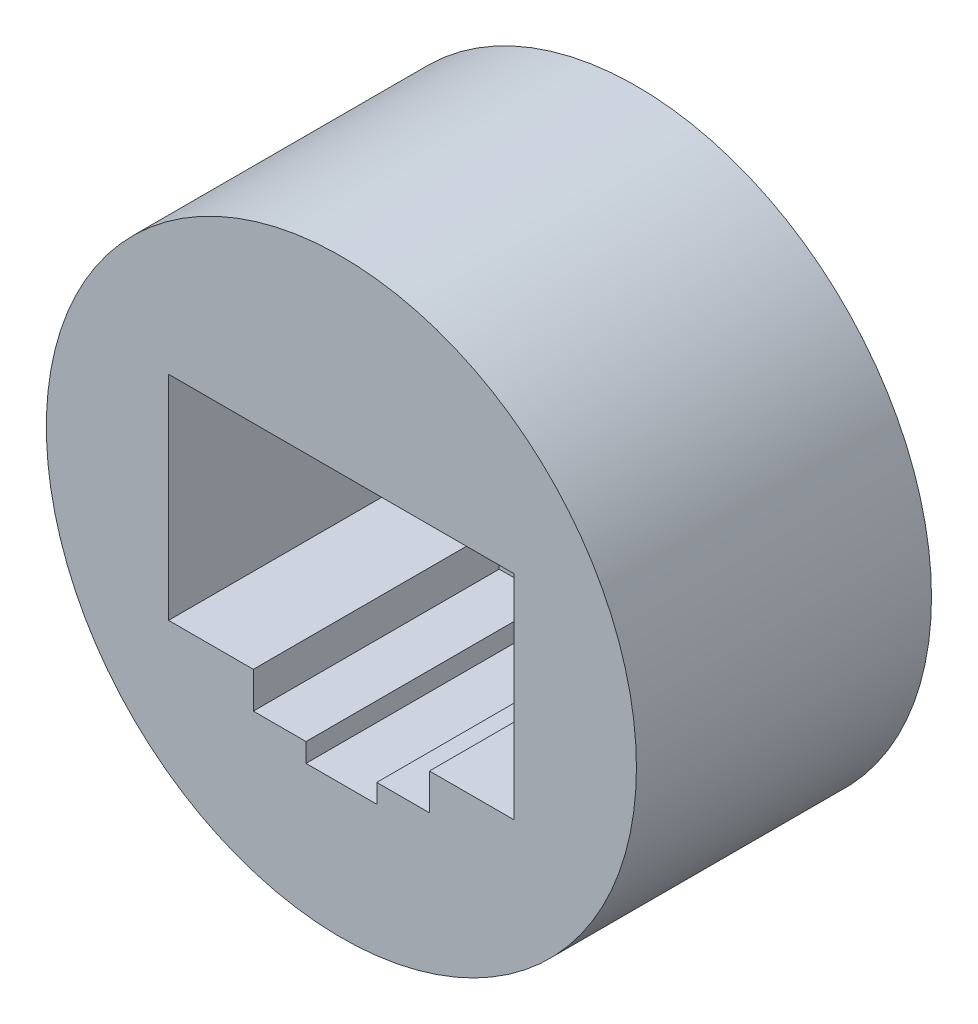
ISO-10303-21;
HEADER;
FILE_DESCRIPTION(('STEP AP214'),'2;1');
FILE_NAME('part.step','',(''),(''),'','','');
FILE_SCHEMA(('AUTOMOTIVE_DESIGN { 1 0 10303 214 1 1 1 1 }'));
ENDSEC;
DATA;
#1=APPLICATION_CONTEXT('core data for automotive mechanical design processes');
#2=APPLICATION_PROTOCOL_DEFINITION('international standard','automotive_design',2000,#1);
#3=PRODUCT_CONTEXT('',#1,'mechanical');
#4=PRODUCT('Part','Part','',(#3));
#5=PRODUCT_RELATED_PRODUCT_CATEGORY('part','',(#4));
#6=PRODUCT_DEFINITION_FORMATION('','',#4);
#7=PRODUCT_DEFINITION_CONTEXT('part definition',#1,'design');
#8=PRODUCT_DEFINITION('design','',#6,#7);
#9=PRODUCT_DEFINITION_SHAPE('','',#8);
#10=(LENGTH_UNIT() NAMED_UNIT(*) SI_UNIT(.MILLI.,.METRE.));
#11=(NAMED_UNIT(*) PLANE_ANGLE_UNIT() SI_UNIT($,.RADIAN.));
#12=(NAMED_UNIT(*) SI_UNIT($,.STERADIAN.) SOLID_ANGLE_UNIT());
#13=UNCERTAINTY_MEASURE_WITH_UNIT(LENGTH_MEASURE(1.E-05),#10,'distance_accuracy_value','');
#14=(GEOMETRIC_REPRESENTATION_CONTEXT(3) GLOBAL_UNCERTAINTY_ASSIGNED_CONTEXT((#13)) GLOBAL_UNIT_ASSIGNED_CONTEXT((#10,
#11,#12)) REPRESENTATION_CONTEXT('',''));
#15=CARTESIAN_POINT('',(0.,0.,0.));
#16=DIRECTION('',(0.,0.,1.));
#17=DIRECTION('',(1.,0.,0.));
#18=AXIS2_PLACEMENT_3D('',#15,#16,#17);
#19=CARTESIAN_POINT('',(0.,0.,12.));
#20=DIRECTION('',(0.,0.,-1.));
#21=DIRECTION('',(-1.,0.,0.));
#22=AXIS2_PLACEMENT_3D('',#19,#20,#21);
#23=CYLINDRICAL_SURFACE('',#22,12.);
#24=CARTESIAN_POINT('',(0.,0.,12.));
#25=DIRECTION('',(0.,0.,1.));
#26=DIRECTION('',(1.,0.,0.));
#27=AXIS2_PLACEMENT_3D('',#24,#25,#26);
#28=CIRCLE('',#27,12.);
#29=CARTESIAN_POINT('',(12.,0.,12.));
#30=VERTEX_POINT('',#29);
#31=EDGE_CURVE('E11',#30,#30,#28,.T.);
#32=ORIENTED_EDGE('',*,*,#31,.F.);
#33=EDGE_LOOP('',(#32));
#34=FACE_BOUND('',#33,.T.);
#35=CARTESIAN_POINT('',(0.,0.,0.));
#36=DIRECTION('',(0.,0.,1.));
#37=DIRECTION('',(1.,0.,0.));
#38=AXIS2_PLACEMENT_3D('',#35,#36,#37);
#39=CIRCLE('',#38,12.);
#40=CARTESIAN_POINT('',(12.,0.,0.));
#41=VERTEX_POINT('',#40);
#42=EDGE_CURVE('E46',#41,#41,#39,.T.);
#43=ORIENTED_EDGE('',*,*,#42,.T.);
#44=EDGE_LOOP('',(#43));
#45=FACE_BOUND('',#44,.T.);
#46=ADVANCED_FACE('F43',(#34,#45),#23,.T.);
#47=CARTESIAN_POINT('',(0.,0.,12.));
#48=DIRECTION('',(0.,0.,1.));
#49=DIRECTION('',(1.,0.,0.));
#50=AXIS2_PLACEMENT_3D('',#47,#48,#49);
#51=PLANE('',#50);
#52=DIRECTION('',(0.,1.,0.));
#53=VECTOR('',#52,1.);
#54=CARTESIAN_POINT('',(7.02862241746174,4.33431715743469,12.));
#55=LINE('',#54,#53);
#56=CARTESIAN_POINT('',(7.02862241746174,-4.33431715743469,12.));
#57=VERTEX_POINT('',#56);
#58=CARTESIAN_POINT('',(7.02862241746174,4.33431715743469,12.));
#59=VERTEX_POINT('',#58);
#60=EDGE_CURVE('E58',#57,#59,#55,.T.);
#61=ORIENTED_EDGE('',*,*,#60,.F.);
#62=DIRECTION('',(1.,0.,0.));
#63=VECTOR('',#62,1.);
#64=CARTESIAN_POINT('',(3.5810483992283,-4.33431715743469,12.));
#65=LINE('',#64,#63);
#66=CARTESIAN_POINT('',(3.5810483992283,-4.33431715743469,12.));
#67=VERTEX_POINT('',#66);
#68=EDGE_CURVE('E211',#67,#57,#65,.T.);
#69=ORIENTED_EDGE('',*,*,#68,.F.);
#70=DIRECTION('',(0.,1.,0.));
#71=VECTOR('',#70,1.);
#72=CARTESIAN_POINT('',(3.5810483992283,-4.33431715743469,12.));
#73=LINE('',#72,#71);
#74=CARTESIAN_POINT('',(3.5810483992283,-5.80710551226217,12.));
#75=VERTEX_POINT('',#74);
#76=EDGE_CURVE('E208',#75,#67,#73,.T.);
#77=ORIENTED_EDGE('',*,*,#76,.F.);
#78=DIRECTION('',(1.,0.,0.));
#79=VECTOR('',#78,1.);
#80=CARTESIAN_POINT('',(1.43919411405169,-5.80710551226217,12.));
#81=LINE('',#80,#79);
#82=CARTESIAN_POINT('',(1.43919411405169,-5.80710551226217,12.));
#83=VERTEX_POINT('',#82);
#84=EDGE_CURVE('E142',#83,#75,#81,.T.);
#85=ORIENTED_EDGE('',*,*,#84,.F.);
#86=DIRECTION('',(0.,1.,0.));
#87=VECTOR('',#86,1.);
#88=CARTESIAN_POINT('',(1.43919411405169,-5.80710551226217,12.));
#89=LINE('',#88,#87);
#90=CARTESIAN_POINT('',(1.43919411405169,-6.57678240491058,12.));
#91=VERTEX_POINT('',#90);
#92=EDGE_CURVE('E202',#91,#83,#89,.T.);
#93=ORIENTED_EDGE('',*,*,#92,.F.);
#94=DIRECTION('',(1.,0.,0.));
#95=VECTOR('',#94,1.);
#96=CARTESIAN_POINT('',(-1.43919411405169,-6.57678240491058,12.));
#97=LINE('',#96,#95);
#98=CARTESIAN_POINT('',(-1.43919411405169,-6.57678240491058,12.));
#99=VERTEX_POINT('',#98);
#100=EDGE_CURVE('E198',#99,#91,#97,.T.);
#101=ORIENTED_EDGE('',*,*,#100,.F.);
#102=DIRECTION('',(0.,-1.,0.));
#103=VECTOR('',#102,1.);
#104=CARTESIAN_POINT('',(-1.43919411405169,-5.80710551226217,12.));
#105=LINE('',#104,#103);
#106=CARTESIAN_POINT('',(-1.43919411405169,-5.80710551226217,12.));
#107=VERTEX_POINT('',#106);
#108=EDGE_CURVE('E194',#107,#99,#105,.T.);
#109=ORIENTED_EDGE('',*,*,#108,.F.);
#110=DIRECTION('',(1.,0.,0.));
#111=VECTOR('',#110,1.);
#112=CARTESIAN_POINT('',(-3.5810483992283,-5.80710551226217,12.));
#113=LINE('',#112,#111);
#114=CARTESIAN_POINT('',(-3.5810483992283,-5.80710551226217,12.));
#115=VERTEX_POINT('',#114);
#116=EDGE_CURVE('E190',#115,#107,#113,.T.);
#117=ORIENTED_EDGE('',*,*,#116,.F.);
#118=DIRECTION('',(0.,-1.,0.));
#119=VECTOR('',#118,1.);
#120=CARTESIAN_POINT('',(-3.5810483992283,-4.33431715743469,12.));
#121=LINE('',#120,#119);
#122=CARTESIAN_POINT('',(-3.5810483992283,-4.33431715743469,12.));
#123=VERTEX_POINT('',#122);
#124=EDGE_CURVE('E186',#123,#115,#121,.T.);
#125=ORIENTED_EDGE('',*,*,#124,.F.);
#126=DIRECTION('',(1.,0.,0.));
#127=VECTOR('',#126,1.);
#128=CARTESIAN_POINT('',(-7.02862241746174,-4.33431715743469,12.));
#129=LINE('',#128,#127);
#130=CARTESIAN_POINT('',(-7.02862241746174,-4.33431715743469,12.));
#131=VERTEX_POINT('',#130);
#132=EDGE_CURVE('E182',#131,#123,#129,.T.);
#133=ORIENTED_EDGE('',*,*,#132,.F.);
#134=DIRECTION('',(0.,-1.,0.));
#135=VECTOR('',#134,1.);
#136=CARTESIAN_POINT('',(-7.02862241746174,4.33431715743469,12.));
#137=LINE('',#136,#135);
#138=CARTESIAN_POINT('',(-7.02862241746174,4.33431715743469,12.));
#139=VERTEX_POINT('',#138);
#140=EDGE_CURVE('E178',#139,#131,#137,.T.);
#141=ORIENTED_EDGE('',*,*,#140,.F.);
#142=DIRECTION('',(-1.,0.,0.));
#143=VECTOR('',#142,1.);
#144=CARTESIAN_POINT('',(-7.02862241746174,4.33431715743469,12.));
#145=LINE('',#144,#143);
#146=EDGE_CURVE('E174',#59,#139,#145,.T.);
#147=ORIENTED_EDGE('',*,*,#146,.F.);
#148=EDGE_LOOP('',(#61,#69,#77,#85,#93,#101,#109,#117,#125,#133,#141,#147));
#149=FACE_BOUND('',#148,.T.);
#150=ORIENTED_EDGE('',*,*,#31,.T.);
#151=EDGE_LOOP('',(#150));
#152=FACE_BOUND('',#151,.T.);
#153=ADVANCED_FACE('F250',(#149,#152),#51,.T.);
#154=CARTESIAN_POINT('',(0.,0.,0.));
#155=DIRECTION('',(0.,0.,1.));
#156=DIRECTION('',(1.,0.,0.));
#157=AXIS2_PLACEMENT_3D('',#154,#155,#156);
#158=PLANE('',#157);
#159=ORIENTED_EDGE('',*,*,#42,.F.);
#160=EDGE_LOOP('',(#159));
#161=FACE_BOUND('',#160,.T.);
#162=ADVANCED_FACE('F301',(#161),#158,.F.);
#163=CARTESIAN_POINT('',(7.02862241746174,4.33431715743469,2.));
#164=DIRECTION('',(1.,0.,0.));
#165=DIRECTION('',(0.,0.,-1.));
#166=AXIS2_PLACEMENT_3D('',#163,#164,#165);
#167=PLANE('',#166);
#168=ORIENTED_EDGE('',*,*,#60,.T.);
#169=DIRECTION('',(0.,0.,1.));
#170=VECTOR('',#169,1.);
#171=CARTESIAN_POINT('',(7.02862241746174,4.33431715743469,2.));
#172=LINE('',#171,#170);
#173=CARTESIAN_POINT('',(7.02862241746174,4.33431715743469,2.));
#174=VERTEX_POINT('',#173);
#175=EDGE_CURVE('E106',#174,#59,#172,.T.);
#176=ORIENTED_EDGE('',*,*,#175,.F.);
#177=DIRECTION('',(0.,1.,0.));
#178=VECTOR('',#177,1.);
#179=CARTESIAN_POINT('',(7.02862241746174,4.33431715743469,2.));
#180=LINE('',#179,#178);
#181=CARTESIAN_POINT('',(7.02862241746174,-4.33431715743469,2.));
#182=VERTEX_POINT('',#181);
#183=EDGE_CURVE('E214',#182,#174,#180,.T.);
#184=ORIENTED_EDGE('',*,*,#183,.F.);
#185=DIRECTION('',(0.,0.,1.));
#186=VECTOR('',#185,1.);
#187=CARTESIAN_POINT('',(7.02862241746174,-4.33431715743469,2.));
#188=LINE('',#187,#186);
#189=EDGE_CURVE('E66',#182,#57,#188,.T.);
#190=ORIENTED_EDGE('',*,*,#189,.T.);
#191=EDGE_LOOP('',(#168,#176,#184,#190));
#192=FACE_BOUND('',#191,.T.);
#193=ADVANCED_FACE('F294',(#192),#167,.F.);
#194=CARTESIAN_POINT('',(3.5810483992283,-4.33431715743469,2.));
#195=DIRECTION('',(0.,-1.,0.));
#196=DIRECTION('',(0.,0.,-1.));
#197=AXIS2_PLACEMENT_3D('',#194,#195,#196);
#198=PLANE('',#197);
#199=ORIENTED_EDGE('',*,*,#68,.T.);
#200=ORIENTED_EDGE('',*,*,#189,.F.);
#201=DIRECTION('',(1.,0.,0.));
#202=VECTOR('',#201,1.);
#203=CARTESIAN_POINT('',(3.5810483992283,-4.33431715743469,2.));
#204=LINE('',#203,#202);
#205=CARTESIAN_POINT('',(3.5810483992283,-4.33431715743469,2.));
#206=VERTEX_POINT('',#205);
#207=EDGE_CURVE('E156',#206,#182,#204,.T.);
#208=ORIENTED_EDGE('',*,*,#207,.F.);
#209=DIRECTION('',(0.,0.,1.));
#210=VECTOR('',#209,1.);
#211=CARTESIAN_POINT('',(3.5810483992283,-4.33431715743469,2.));
#212=LINE('',#211,#210);
#213=EDGE_CURVE('E147',#206,#67,#212,.T.);
#214=ORIENTED_EDGE('',*,*,#213,.T.);
#215=EDGE_LOOP('',(#199,#200,#208,#214));
#216=FACE_BOUND('',#215,.T.);
#217=ADVANCED_FACE('F292',(#216),#198,.F.);
#218=CARTESIAN_POINT('',(3.5810483992283,-4.33431715743469,2.));
#219=DIRECTION('',(1.,0.,0.));
#220=DIRECTION('',(0.,1.,0.));
#221=AXIS2_PLACEMENT_3D('',#218,#219,#220);
#222=PLANE('',#221);
#223=ORIENTED_EDGE('',*,*,#76,.T.);
#224=ORIENTED_EDGE('',*,*,#213,.F.);
#225=DIRECTION('',(0.,1.,0.));
#226=VECTOR('',#225,1.);
#227=CARTESIAN_POINT('',(3.5810483992283,-4.33431715743469,2.));
#228=LINE('',#227,#226);
#229=CARTESIAN_POINT('',(3.5810483992283,-5.80710551226217,2.));
#230=VERTEX_POINT('',#229);
#231=EDGE_CURVE('E151',#230,#206,#228,.T.);
#232=ORIENTED_EDGE('',*,*,#231,.F.);
#233=DIRECTION('',(0.,0.,1.));
#234=VECTOR('',#233,1.);
#235=CARTESIAN_POINT('',(3.5810483992283,-5.80710551226217,2.));
#236=LINE('',#235,#234);
#237=EDGE_CURVE('E135',#230,#75,#236,.T.);
#238=ORIENTED_EDGE('',*,*,#237,.T.);
#239=EDGE_LOOP('',(#223,#224,#232,#238));
#240=FACE_BOUND('',#239,.T.);
#241=ADVANCED_FACE('F152',(#240),#222,.F.);
#242=CARTESIAN_POINT('',(1.43919411405169,-5.80710551226217,2.));
#243=DIRECTION('',(0.,-1.,0.));
#244=DIRECTION('',(0.,0.,-1.));
#245=AXIS2_PLACEMENT_3D('',#242,#243,#244);
#246=PLANE('',#245);
#247=ORIENTED_EDGE('',*,*,#84,.T.);
#248=ORIENTED_EDGE('',*,*,#237,.F.);
#249=DIRECTION('',(1.,0.,0.));
#250=VECTOR('',#249,1.);
#251=CARTESIAN_POINT('',(1.43919411405169,-5.80710551226217,2.));
#252=LINE('',#251,#250);
#253=CARTESIAN_POINT('',(1.43919411405169,-5.80710551226217,2.));
#254=VERTEX_POINT('',#253);
#255=EDGE_CURVE('E139',#254,#230,#252,.T.);
#256=ORIENTED_EDGE('',*,*,#255,.F.);
#257=DIRECTION('',(0.,0.,1.));
#258=VECTOR('',#257,1.);
#259=CARTESIAN_POINT('',(1.43919411405169,-5.80710551226217,2.));
#260=LINE('',#259,#258);
#261=EDGE_CURVE('E148',#254,#83,#260,.T.);
#262=ORIENTED_EDGE('',*,*,#261,.T.);
#263=EDGE_LOOP('',(#247,#248,#256,#262));
#264=FACE_BOUND('',#263,.T.);
#265=ADVANCED_FACE('F137',(#264),#246,.F.);
#266=CARTESIAN_POINT('',(1.43919411405169,-5.80710551226217,2.));
#267=DIRECTION('',(1.,0.,0.));
#268=DIRECTION('',(0.,0.,-1.));
#269=AXIS2_PLACEMENT_3D('',#266,#267,#268);
#270=PLANE('',#269);
#271=ORIENTED_EDGE('',*,*,#92,.T.);
#272=ORIENTED_EDGE('',*,*,#261,.F.);
#273=DIRECTION('',(0.,1.,0.));
#274=VECTOR('',#273,1.);
#275=CARTESIAN_POINT('',(1.43919411405169,-5.80710551226217,2.));
#276=LINE('',#275,#274);
#277=CARTESIAN_POINT('',(1.43919411405169,-6.57678240491058,2.));
#278=VERTEX_POINT('',#277);
#279=EDGE_CURVE('E162',#278,#254,#276,.T.);
#280=ORIENTED_EDGE('',*,*,#279,.F.);
#281=DIRECTION('',(0.,0.,1.));
#282=VECTOR('',#281,1.);
#283=CARTESIAN_POINT('',(1.43919411405169,-6.57678240491058,2.));
#284=LINE('',#283,#282);
#285=EDGE_CURVE('E221',#278,#91,#284,.T.);
#286=ORIENTED_EDGE('',*,*,#285,.T.);
#287=EDGE_LOOP('',(#271,#272,#280,#286));
#288=FACE_BOUND('',#287,.T.);
#289=ADVANCED_FACE('F291',(#288),#270,.F.);
#290=CARTESIAN_POINT('',(-1.43919411405169,-6.57678240491058,2.));
#291=DIRECTION('',(0.,-1.,0.));
#292=DIRECTION('',(0.,0.,-1.));
#293=AXIS2_PLACEMENT_3D('',#290,#291,#292);
#294=PLANE('',#293);
#295=ORIENTED_EDGE('',*,*,#100,.T.);
#296=ORIENTED_EDGE('',*,*,#285,.F.);
#297=DIRECTION('',(1.,0.,0.));
#298=VECTOR('',#297,1.);
#299=CARTESIAN_POINT('',(-1.43919411405169,-6.57678240491058,2.));
#300=LINE('',#299,#298);
#301=CARTESIAN_POINT('',(-1.43919411405169,-6.57678240491058,2.));
#302=VERTEX_POINT('',#301);
#303=EDGE_CURVE('E166',#302,#278,#300,.T.);
#304=ORIENTED_EDGE('',*,*,#303,.F.);
#305=DIRECTION('',(0.,0.,1.));
#306=VECTOR('',#305,1.);
#307=CARTESIAN_POINT('',(-1.43919411405169,-6.57678240491058,2.));
#308=LINE('',#307,#306);
#309=EDGE_CURVE('E224',#302,#99,#308,.T.);
#310=ORIENTED_EDGE('',*,*,#309,.T.);
#311=EDGE_LOOP('',(#295,#296,#304,#310));
#312=FACE_BOUND('',#311,.T.);
#313=ADVANCED_FACE('F287',(#312),#294,.F.);
#314=CARTESIAN_POINT('',(-1.43919411405169,-5.80710551226217,2.));
#315=DIRECTION('',(-1.,0.,0.));
#316=DIRECTION('',(0.,0.,1.));
#317=AXIS2_PLACEMENT_3D('',#314,#315,#316);
#318=PLANE('',#317);
#319=ORIENTED_EDGE('',*,*,#108,.T.);
#320=ORIENTED_EDGE('',*,*,#309,.F.);
#321=DIRECTION('',(0.,-1.,0.));
#322=VECTOR('',#321,1.);
#323=CARTESIAN_POINT('',(-1.43919411405169,-5.80710551226217,2.));
#324=LINE('',#323,#322);
#325=CARTESIAN_POINT('',(-1.43919411405169,-5.80710551226217,2.));
#326=VERTEX_POINT('',#325);
#327=EDGE_CURVE('E280',#326,#302,#324,.T.);
#328=ORIENTED_EDGE('',*,*,#327,.F.);
#329=DIRECTION('',(0.,0.,1.));
#330=VECTOR('',#329,1.);
#331=CARTESIAN_POINT('',(-1.43919411405169,-5.80710551226217,2.));
#332=LINE('',#331,#330);
#333=EDGE_CURVE('E227',#326,#107,#332,.T.);
#334=ORIENTED_EDGE('',*,*,#333,.T.);
#335=EDGE_LOOP('',(#319,#320,#328,#334));
#336=FACE_BOUND('',#335,.T.);
#337=ADVANCED_FACE('F335',(#336),#318,.F.);
#338=CARTESIAN_POINT('',(-3.5810483992283,-5.80710551226217,2.));
#339=DIRECTION('',(0.,-1.,0.));
#340=DIRECTION('',(0.,0.,-1.));
#341=AXIS2_PLACEMENT_3D('',#338,#339,#340);
#342=PLANE('',#341);
#343=ORIENTED_EDGE('',*,*,#116,.T.);
#344=ORIENTED_EDGE('',*,*,#333,.F.);
#345=DIRECTION('',(1.,0.,0.));
#346=VECTOR('',#345,1.);
#347=CARTESIAN_POINT('',(-3.5810483992283,-5.80710551226217,2.));
#348=LINE('',#347,#346);
#349=CARTESIAN_POINT('',(-3.5810483992283,-5.80710551226217,2.));
#350=VERTEX_POINT('',#349);
#351=EDGE_CURVE('E276',#350,#326,#348,.T.);
#352=ORIENTED_EDGE('',*,*,#351,.F.);
#353=DIRECTION('',(0.,0.,1.));
#354=VECTOR('',#353,1.);
#355=CARTESIAN_POINT('',(-3.5810483992283,-5.80710551226217,2.));
#356=LINE('',#355,#354);
#357=EDGE_CURVE('E230',#350,#115,#356,.T.);
#358=ORIENTED_EDGE('',*,*,#357,.T.);
#359=EDGE_LOOP('',(#343,#344,#352,#358));
#360=FACE_BOUND('',#359,.T.);
#361=ADVANCED_FACE('F331',(#360),#342,.F.);
#362=CARTESIAN_POINT('',(-3.5810483992283,-4.33431715743469,2.));
#363=DIRECTION('',(-1.,0.,0.));
#364=DIRECTION('',(0.,0.,1.));
#365=AXIS2_PLACEMENT_3D('',#362,#363,#364);
#366=PLANE('',#365);
#367=ORIENTED_EDGE('',*,*,#124,.T.);
#368=ORIENTED_EDGE('',*,*,#357,.F.);
#369=DIRECTION('',(0.,-1.,0.));
#370=VECTOR('',#369,1.);
#371=CARTESIAN_POINT('',(-3.5810483992283,-4.33431715743469,2.));
#372=LINE('',#371,#370);
#373=CARTESIAN_POINT('',(-3.5810483992283,-4.33431715743469,2.));
#374=VERTEX_POINT('',#373);
#375=EDGE_CURVE('E272',#374,#350,#372,.T.);
#376=ORIENTED_EDGE('',*,*,#375,.F.);
#377=DIRECTION('',(0.,0.,1.));
#378=VECTOR('',#377,1.);
#379=CARTESIAN_POINT('',(-3.5810483992283,-4.33431715743469,2.));
#380=LINE('',#379,#378);
#381=EDGE_CURVE('E233',#374,#123,#380,.T.);
#382=ORIENTED_EDGE('',*,*,#381,.T.);
#383=EDGE_LOOP('',(#367,#368,#376,#382));
#384=FACE_BOUND('',#383,.T.);
#385=ADVANCED_FACE('F327',(#384),#366,.F.);
#386=CARTESIAN_POINT('',(-7.02862241746174,-4.33431715743469,2.));
#387=DIRECTION('',(0.,-1.,0.));
#388=DIRECTION('',(0.,0.,-1.));
#389=AXIS2_PLACEMENT_3D('',#386,#387,#388);
#390=PLANE('',#389);
#391=ORIENTED_EDGE('',*,*,#132,.T.);
#392=ORIENTED_EDGE('',*,*,#381,.F.);
#393=DIRECTION('',(1.,0.,0.));
#394=VECTOR('',#393,1.);
#395=CARTESIAN_POINT('',(-7.02862241746174,-4.33431715743469,2.));
#396=LINE('',#395,#394);
#397=CARTESIAN_POINT('',(-7.02862241746174,-4.33431715743469,2.));
#398=VERTEX_POINT('',#397);
#399=EDGE_CURVE('E263',#398,#374,#396,.T.);
#400=ORIENTED_EDGE('',*,*,#399,.F.);
#401=DIRECTION('',(0.,0.,1.));
#402=VECTOR('',#401,1.);
#403=CARTESIAN_POINT('',(-7.02862241746174,-4.33431715743469,2.));
#404=LINE('',#403,#402);
#405=EDGE_CURVE('E236',#398,#131,#404,.T.);
#406=ORIENTED_EDGE('',*,*,#405,.T.);
#407=EDGE_LOOP('',(#391,#392,#400,#406));
#408=FACE_BOUND('',#407,.T.);
#409=ADVANCED_FACE('F324',(#408),#390,.F.);
#410=CARTESIAN_POINT('',(-7.02862241746174,4.33431715743469,2.));
#411=DIRECTION('',(-1.,0.,0.));
#412=DIRECTION('',(0.,0.,1.));
#413=AXIS2_PLACEMENT_3D('',#410,#411,#412);
#414=PLANE('',#413);
#415=ORIENTED_EDGE('',*,*,#140,.T.);
#416=ORIENTED_EDGE('',*,*,#405,.F.);
#417=DIRECTION('',(0.,-1.,0.));
#418=VECTOR('',#417,1.);
#419=CARTESIAN_POINT('',(-7.02862241746174,4.33431715743469,2.));
#420=LINE('',#419,#418);
#421=CARTESIAN_POINT('',(-7.02862241746174,4.33431715743469,2.));
#422=VERTEX_POINT('',#421);
#423=EDGE_CURVE('E260',#422,#398,#420,.T.);
#424=ORIENTED_EDGE('',*,*,#423,.F.);
#425=DIRECTION('',(0.,0.,1.));
#426=VECTOR('',#425,1.);
#427=CARTESIAN_POINT('',(-7.02862241746174,4.33431715743469,2.));
#428=LINE('',#427,#426);
#429=EDGE_CURVE('E239',#422,#139,#428,.T.);
#430=ORIENTED_EDGE('',*,*,#429,.T.);
#431=EDGE_LOOP('',(#415,#416,#424,#430));
#432=FACE_BOUND('',#431,.T.);
#433=ADVANCED_FACE('F256',(#432),#414,.F.);
#434=CARTESIAN_POINT('',(-7.02862241746174,4.33431715743469,2.));
#435=DIRECTION('',(0.,1.,0.));
#436=DIRECTION('',(0.,0.,1.));
#437=AXIS2_PLACEMENT_3D('',#434,#435,#436);
#438=PLANE('',#437);
#439=ORIENTED_EDGE('',*,*,#146,.T.);
#440=ORIENTED_EDGE('',*,*,#429,.F.);
#441=DIRECTION('',(-1.,0.,0.));
#442=VECTOR('',#441,1.);
#443=CARTESIAN_POINT('',(-7.02862241746174,4.33431715743469,2.));
#444=LINE('',#443,#442);
#445=EDGE_CURVE('E248',#174,#422,#444,.T.);
#446=ORIENTED_EDGE('',*,*,#445,.F.);
#447=ORIENTED_EDGE('',*,*,#175,.T.);
#448=EDGE_LOOP('',(#439,#440,#446,#447));
#449=FACE_BOUND('',#448,.T.);
#450=ADVANCED_FACE('F245',(#449),#438,.F.);
#451=CARTESIAN_POINT('',(0.,0.,2.));
#452=DIRECTION('',(0.,0.,1.));
#453=DIRECTION('',(1.,0.,0.));
#454=AXIS2_PLACEMENT_3D('',#451,#452,#453);
#455=PLANE('',#454);
#456=ORIENTED_EDGE('',*,*,#183,.T.);
#457=ORIENTED_EDGE('',*,*,#445,.T.);
#458=ORIENTED_EDGE('',*,*,#423,.T.);
#459=ORIENTED_EDGE('',*,*,#399,.T.);
#460=ORIENTED_EDGE('',*,*,#375,.T.);
#461=ORIENTED_EDGE('',*,*,#351,.T.);
#462=ORIENTED_EDGE('',*,*,#327,.T.);
#463=ORIENTED_EDGE('',*,*,#303,.T.);
#464=ORIENTED_EDGE('',*,*,#279,.T.);
#465=ORIENTED_EDGE('',*,*,#255,.T.);
#466=ORIENTED_EDGE('',*,*,#231,.T.);
#467=ORIENTED_EDGE('',*,*,#207,.T.);
#468=EDGE_LOOP('',(#456,#457,#458,#459,#460,#461,#462,#463,#464,#465,#466,#467));
#469=FACE_BOUND('',#468,.T.);
#470=ADVANCED_FACE('F159',(#469),#455,.T.);
#471=CLOSED_SHELL('',(#46,#153,#162,#193,#217,#241,#265,#289,#313,#337,#361,#385,#409,#433,#450,#470));
#472=MANIFOLD_SOLID_BREP('B2',#471);
#473=ADVANCED_BREP_SHAPE_REPRESENTATION('',(#18,#472),#14);
#474=SHAPE_DEFINITION_REPRESENTATION(#9,#473);
ENDSEC;
END-ISO-10303-21;
